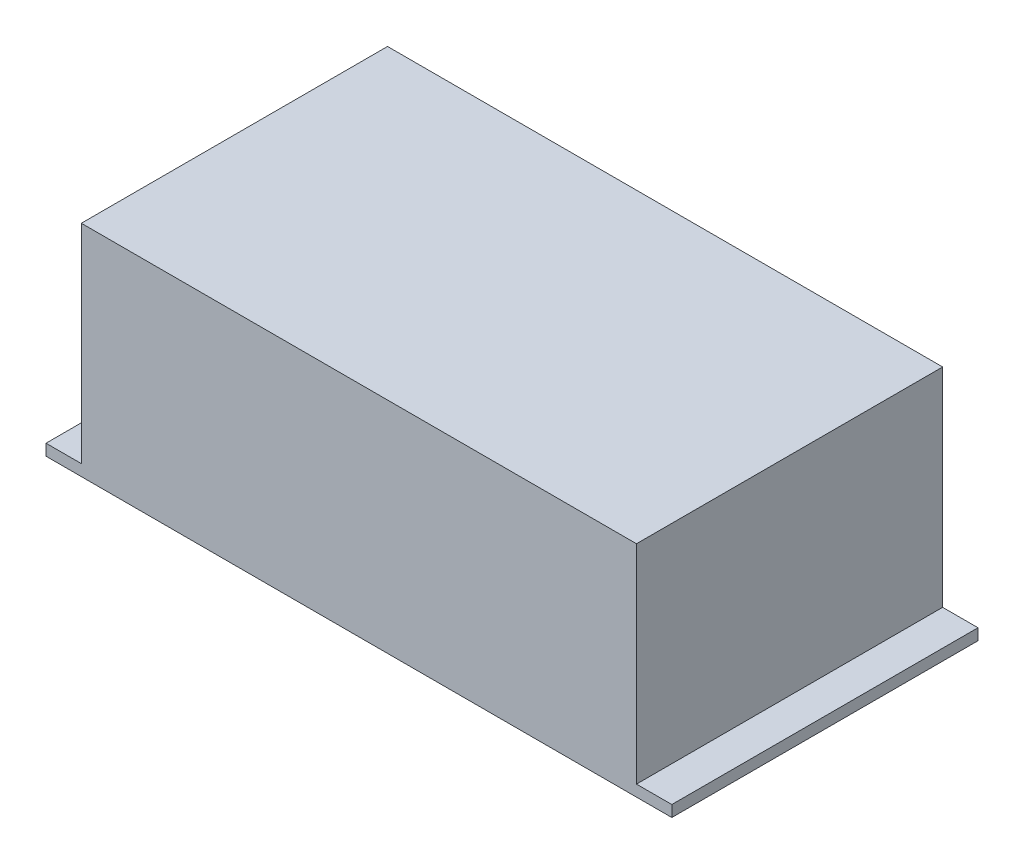
ISO-10303-21;
HEADER;
FILE_DESCRIPTION(('STEP AP214'),'2;1');
FILE_NAME('part.step','',(''),(''),'','','');
FILE_SCHEMA(('AUTOMOTIVE_DESIGN { 1 0 10303 214 1 1 1 1 }'));
ENDSEC;
DATA;
#1=APPLICATION_CONTEXT('core data for automotive mechanical design processes');
#2=APPLICATION_PROTOCOL_DEFINITION('international standard','automotive_design',2000,#1);
#3=PRODUCT_CONTEXT('',#1,'mechanical');
#4=PRODUCT('Part','Part','',(#3));
#5=PRODUCT_RELATED_PRODUCT_CATEGORY('part','',(#4));
#6=PRODUCT_DEFINITION_FORMATION('','',#4);
#7=PRODUCT_DEFINITION_CONTEXT('part definition',#1,'design');
#8=PRODUCT_DEFINITION('design','',#6,#7);
#9=PRODUCT_DEFINITION_SHAPE('','',#8);
#10=(LENGTH_UNIT() NAMED_UNIT(*) SI_UNIT(.MILLI.,.METRE.));
#11=(NAMED_UNIT(*) PLANE_ANGLE_UNIT() SI_UNIT($,.RADIAN.));
#12=(NAMED_UNIT(*) SI_UNIT($,.STERADIAN.) SOLID_ANGLE_UNIT());
#13=UNCERTAINTY_MEASURE_WITH_UNIT(LENGTH_MEASURE(1.E-05),#10,'distance_accuracy_value','');
#14=(GEOMETRIC_REPRESENTATION_CONTEXT(3) GLOBAL_UNCERTAINTY_ASSIGNED_CONTEXT((#13)) GLOBAL_UNIT_ASSIGNED_CONTEXT((#10,
#11,#12)) REPRESENTATION_CONTEXT('',''));
#15=CARTESIAN_POINT('',(0.,0.,0.));
#16=DIRECTION('',(0.,0.,1.));
#17=DIRECTION('',(1.,0.,0.));
#18=AXIS2_PLACEMENT_3D('',#15,#16,#17);
#19=CARTESIAN_POINT('',(0.,1.3,0.));
#20=DIRECTION('',(0.,1.,0.));
#21=DIRECTION('',(0.,0.,1.));
#22=AXIS2_PLACEMENT_3D('',#19,#20,#21);
#23=PLANE('',#22);
#24=DIRECTION('',(0.,0.,-1.));
#25=VECTOR('',#24,1.);
#26=CARTESIAN_POINT('',(68.075,1.3,35.3));
#27=LINE('',#26,#25);
#28=CARTESIAN_POINT('',(68.075,1.3,35.3));
#29=VERTEX_POINT('',#28);
#30=CARTESIAN_POINT('',(68.075,1.3,0.));
#31=VERTEX_POINT('',#30);
#32=EDGE_CURVE('E129',#29,#31,#27,.T.);
#33=ORIENTED_EDGE('',*,*,#32,.F.);
#34=DIRECTION('',(1.,0.,0.));
#35=VECTOR('',#34,1.);
#36=CARTESIAN_POINT('',(0.,1.3,35.3));
#37=LINE('',#36,#35);
#38=CARTESIAN_POINT('',(72.15,1.3,35.3));
#39=VERTEX_POINT('',#38);
#40=EDGE_CURVE('E145',#29,#39,#37,.T.);
#41=ORIENTED_EDGE('',*,*,#40,.T.);
#42=DIRECTION('',(0.,0.,-1.));
#43=VECTOR('',#42,1.);
#44=CARTESIAN_POINT('',(72.15,1.3,0.));
#45=LINE('',#44,#43);
#46=CARTESIAN_POINT('',(72.15,1.3,0.));
#47=VERTEX_POINT('',#46);
#48=EDGE_CURVE('E149',#39,#47,#45,.T.);
#49=ORIENTED_EDGE('',*,*,#48,.T.);
#50=DIRECTION('',(-1.,0.,0.));
#51=VECTOR('',#50,1.);
#52=CARTESIAN_POINT('',(0.,1.3,0.));
#53=LINE('',#52,#51);
#54=EDGE_CURVE('E65',#47,#31,#53,.T.);
#55=ORIENTED_EDGE('',*,*,#54,.T.);
#56=EDGE_LOOP('',(#33,#41,#49,#55));
#57=FACE_BOUND('',#56,.T.);
#58=ADVANCED_FACE('F40',(#57),#23,.T.);
#59=CARTESIAN_POINT('',(0.,1.3,0.));
#60=DIRECTION('',(1.,0.,0.));
#61=DIRECTION('',(0.,0.,-1.));
#62=AXIS2_PLACEMENT_3D('',#59,#60,#61);
#63=PLANE('',#62);
#64=DIRECTION('',(0.,0.,1.));
#65=VECTOR('',#64,1.);
#66=CARTESIAN_POINT('',(0.,0.,0.));
#67=LINE('',#66,#65);
#68=CARTESIAN_POINT('',(0.,0.,0.));
#69=VERTEX_POINT('',#68);
#70=CARTESIAN_POINT('',(0.,0.,35.3));
#71=VERTEX_POINT('',#70);
#72=EDGE_CURVE('E130',#69,#71,#67,.T.);
#73=ORIENTED_EDGE('',*,*,#72,.T.);
#74=DIRECTION('',(0.,-1.,0.));
#75=VECTOR('',#74,1.);
#76=CARTESIAN_POINT('',(0.,1.3,35.3));
#77=LINE('',#76,#75);
#78=CARTESIAN_POINT('',(0.,1.3,35.3));
#79=VERTEX_POINT('',#78);
#80=EDGE_CURVE('E11',#79,#71,#77,.T.);
#81=ORIENTED_EDGE('',*,*,#80,.F.);
#82=DIRECTION('',(0.,0.,1.));
#83=VECTOR('',#82,1.);
#84=CARTESIAN_POINT('',(0.,1.3,0.));
#85=LINE('',#84,#83);
#86=CARTESIAN_POINT('',(0.,1.3,0.));
#87=VERTEX_POINT('',#86);
#88=EDGE_CURVE('E141',#87,#79,#85,.T.);
#89=ORIENTED_EDGE('',*,*,#88,.F.);
#90=DIRECTION('',(0.,-1.,0.));
#91=VECTOR('',#90,1.);
#92=CARTESIAN_POINT('',(0.,1.3,0.));
#93=LINE('',#92,#91);
#94=EDGE_CURVE('E152',#87,#69,#93,.T.);
#95=ORIENTED_EDGE('',*,*,#94,.T.);
#96=EDGE_LOOP('',(#73,#81,#89,#95));
#97=FACE_BOUND('',#96,.T.);
#98=ADVANCED_FACE('F42',(#97),#63,.F.);
#99=CARTESIAN_POINT('',(0.,1.3,35.3));
#100=DIRECTION('',(0.,0.,-1.));
#101=DIRECTION('',(-1.,0.,0.));
#102=AXIS2_PLACEMENT_3D('',#99,#100,#101);
#103=PLANE('',#102);
#104=DIRECTION('',(1.,0.,0.));
#105=VECTOR('',#104,1.);
#106=CARTESIAN_POINT('',(0.,0.,35.3));
#107=LINE('',#106,#105);
#108=CARTESIAN_POINT('',(72.15,0.,35.3));
#109=VERTEX_POINT('',#108);
#110=EDGE_CURVE('E134',#71,#109,#107,.T.);
#111=ORIENTED_EDGE('',*,*,#110,.T.);
#112=DIRECTION('',(0.,-1.,0.));
#113=VECTOR('',#112,1.);
#114=CARTESIAN_POINT('',(72.15,1.3,35.3));
#115=LINE('',#114,#113);
#116=EDGE_CURVE('E48',#39,#109,#115,.T.);
#117=ORIENTED_EDGE('',*,*,#116,.F.);
#118=ORIENTED_EDGE('',*,*,#40,.F.);
#119=DIRECTION('',(0.,-1.,0.));
#120=VECTOR('',#119,1.);
#121=CARTESIAN_POINT('',(68.075,25.3,35.3));
#122=LINE('',#121,#120);
#123=CARTESIAN_POINT('',(68.075,25.3,35.3));
#124=VERTEX_POINT('',#123);
#125=EDGE_CURVE('E187',#124,#29,#122,.T.);
#126=ORIENTED_EDGE('',*,*,#125,.F.);
#127=DIRECTION('',(1.,0.,0.));
#128=VECTOR('',#127,1.);
#129=CARTESIAN_POINT('',(68.075,25.3,35.3));
#130=LINE('',#129,#128);
#131=CARTESIAN_POINT('',(4.075,25.3,35.3));
#132=VERTEX_POINT('',#131);
#133=EDGE_CURVE('E123',#132,#124,#130,.T.);
#134=ORIENTED_EDGE('',*,*,#133,.F.);
#135=DIRECTION('',(0.,-1.,0.));
#136=VECTOR('',#135,1.);
#137=CARTESIAN_POINT('',(4.075,25.3,35.3));
#138=LINE('',#137,#136);
#139=CARTESIAN_POINT('',(4.075,1.3,35.3));
#140=VERTEX_POINT('',#139);
#141=EDGE_CURVE('E137',#132,#140,#138,.T.);
#142=ORIENTED_EDGE('',*,*,#141,.T.);
#143=EDGE_CURVE('E147',#79,#140,#37,.T.);
#144=ORIENTED_EDGE('',*,*,#143,.F.);
#145=ORIENTED_EDGE('',*,*,#80,.T.);
#146=EDGE_LOOP('',(#111,#117,#118,#126,#134,#142,#144,#145));
#147=FACE_BOUND('',#146,.T.);
#148=ADVANCED_FACE('F193',(#147),#103,.F.);
#149=CARTESIAN_POINT('',(72.15,1.3,0.));
#150=DIRECTION('',(-1.,0.,0.));
#151=DIRECTION('',(0.,0.,1.));
#152=AXIS2_PLACEMENT_3D('',#149,#150,#151);
#153=PLANE('',#152);
#154=DIRECTION('',(0.,0.,-1.));
#155=VECTOR('',#154,1.);
#156=CARTESIAN_POINT('',(72.15,0.,0.));
#157=LINE('',#156,#155);
#158=CARTESIAN_POINT('',(72.15,0.,0.));
#159=VERTEX_POINT('',#158);
#160=EDGE_CURVE('E156',#109,#159,#157,.T.);
#161=ORIENTED_EDGE('',*,*,#160,.T.);
#162=DIRECTION('',(0.,-1.,0.));
#163=VECTOR('',#162,1.);
#164=CARTESIAN_POINT('',(72.15,1.3,0.));
#165=LINE('',#164,#163);
#166=EDGE_CURVE('E162',#47,#159,#165,.T.);
#167=ORIENTED_EDGE('',*,*,#166,.F.);
#168=ORIENTED_EDGE('',*,*,#48,.F.);
#169=ORIENTED_EDGE('',*,*,#116,.T.);
#170=EDGE_LOOP('',(#161,#167,#168,#169));
#171=FACE_BOUND('',#170,.T.);
#172=ADVANCED_FACE('F169',(#171),#153,.F.);
#173=CARTESIAN_POINT('',(0.,1.3,0.));
#174=DIRECTION('',(0.,0.,1.));
#175=DIRECTION('',(1.,0.,0.));
#176=AXIS2_PLACEMENT_3D('',#173,#174,#175);
#177=PLANE('',#176);
#178=DIRECTION('',(-1.,0.,0.));
#179=VECTOR('',#178,1.);
#180=CARTESIAN_POINT('',(0.,0.,0.));
#181=LINE('',#180,#179);
#182=EDGE_CURVE('E146',#159,#69,#181,.T.);
#183=ORIENTED_EDGE('',*,*,#182,.T.);
#184=ORIENTED_EDGE('',*,*,#94,.F.);
#185=CARTESIAN_POINT('',(4.075,1.3,0.));
#186=VERTEX_POINT('',#185);
#187=EDGE_CURVE('E151',#186,#87,#53,.T.);
#188=ORIENTED_EDGE('',*,*,#187,.F.);
#189=DIRECTION('',(0.,-1.,0.));
#190=VECTOR('',#189,1.);
#191=CARTESIAN_POINT('',(4.075,25.3,0.));
#192=LINE('',#191,#190);
#193=CARTESIAN_POINT('',(4.075,25.3,0.));
#194=VERTEX_POINT('',#193);
#195=EDGE_CURVE('E113',#194,#186,#192,.T.);
#196=ORIENTED_EDGE('',*,*,#195,.F.);
#197=DIRECTION('',(-1.,0.,0.));
#198=VECTOR('',#197,1.);
#199=CARTESIAN_POINT('',(68.075,25.3,0.));
#200=LINE('',#199,#198);
#201=CARTESIAN_POINT('',(68.075,25.3,0.));
#202=VERTEX_POINT('',#201);
#203=EDGE_CURVE('E106',#202,#194,#200,.T.);
#204=ORIENTED_EDGE('',*,*,#203,.F.);
#205=DIRECTION('',(0.,-1.,0.));
#206=VECTOR('',#205,1.);
#207=CARTESIAN_POINT('',(68.075,25.3,0.));
#208=LINE('',#207,#206);
#209=EDGE_CURVE('E110',#202,#31,#208,.T.);
#210=ORIENTED_EDGE('',*,*,#209,.T.);
#211=ORIENTED_EDGE('',*,*,#54,.F.);
#212=ORIENTED_EDGE('',*,*,#166,.T.);
#213=EDGE_LOOP('',(#183,#184,#188,#196,#204,#210,#211,#212));
#214=FACE_BOUND('',#213,.T.);
#215=ADVANCED_FACE('F108',(#214),#177,.F.);
#216=DIRECTION('',(0.,0.,1.));
#217=VECTOR('',#216,1.);
#218=CARTESIAN_POINT('',(4.075,1.3,35.3));
#219=LINE('',#218,#217);
#220=EDGE_CURVE('E57',#186,#140,#219,.T.);
#221=ORIENTED_EDGE('',*,*,#220,.F.);
#222=ORIENTED_EDGE('',*,*,#187,.T.);
#223=ORIENTED_EDGE('',*,*,#88,.T.);
#224=ORIENTED_EDGE('',*,*,#143,.T.);
#225=EDGE_LOOP('',(#221,#222,#223,#224));
#226=FACE_BOUND('',#225,.T.);
#227=ADVANCED_FACE('F181',(#226),#23,.T.);
#228=CARTESIAN_POINT('',(0.,0.,0.));
#229=DIRECTION('',(0.,1.,0.));
#230=DIRECTION('',(0.,0.,1.));
#231=AXIS2_PLACEMENT_3D('',#228,#229,#230);
#232=PLANE('',#231);
#233=ORIENTED_EDGE('',*,*,#72,.F.);
#234=ORIENTED_EDGE('',*,*,#182,.F.);
#235=ORIENTED_EDGE('',*,*,#160,.F.);
#236=ORIENTED_EDGE('',*,*,#110,.F.);
#237=EDGE_LOOP('',(#233,#234,#235,#236));
#238=FACE_BOUND('',#237,.T.);
#239=ADVANCED_FACE('F176',(#238),#232,.F.);
#240=CARTESIAN_POINT('',(68.075,25.3,35.3));
#241=DIRECTION('',(-1.,0.,0.));
#242=DIRECTION('',(0.,0.,1.));
#243=AXIS2_PLACEMENT_3D('',#240,#241,#242);
#244=PLANE('',#243);
#245=ORIENTED_EDGE('',*,*,#32,.T.);
#246=ORIENTED_EDGE('',*,*,#209,.F.);
#247=DIRECTION('',(0.,0.,-1.));
#248=VECTOR('',#247,1.);
#249=CARTESIAN_POINT('',(68.075,25.3,35.3));
#250=LINE('',#249,#248);
#251=EDGE_CURVE('E118',#124,#202,#250,.T.);
#252=ORIENTED_EDGE('',*,*,#251,.F.);
#253=ORIENTED_EDGE('',*,*,#125,.T.);
#254=EDGE_LOOP('',(#245,#246,#252,#253));
#255=FACE_BOUND('',#254,.T.);
#256=ADVANCED_FACE('F128',(#255),#244,.F.);
#257=CARTESIAN_POINT('',(4.075,25.3,35.3));
#258=DIRECTION('',(1.,0.,0.));
#259=DIRECTION('',(0.,0.,-1.));
#260=AXIS2_PLACEMENT_3D('',#257,#258,#259);
#261=PLANE('',#260);
#262=ORIENTED_EDGE('',*,*,#220,.T.);
#263=ORIENTED_EDGE('',*,*,#141,.F.);
#264=DIRECTION('',(0.,0.,1.));
#265=VECTOR('',#264,1.);
#266=CARTESIAN_POINT('',(4.075,25.3,35.3));
#267=LINE('',#266,#265);
#268=EDGE_CURVE('E117',#194,#132,#267,.T.);
#269=ORIENTED_EDGE('',*,*,#268,.F.);
#270=ORIENTED_EDGE('',*,*,#195,.T.);
#271=EDGE_LOOP('',(#262,#263,#269,#270));
#272=FACE_BOUND('',#271,.T.);
#273=ADVANCED_FACE('F195',(#272),#261,.F.);
#274=CARTESIAN_POINT('',(0.,25.3,0.));
#275=DIRECTION('',(0.,1.,0.));
#276=DIRECTION('',(0.,0.,1.));
#277=AXIS2_PLACEMENT_3D('',#274,#275,#276);
#278=PLANE('',#277);
#279=ORIENTED_EDGE('',*,*,#251,.T.);
#280=ORIENTED_EDGE('',*,*,#203,.T.);
#281=ORIENTED_EDGE('',*,*,#268,.T.);
#282=ORIENTED_EDGE('',*,*,#133,.T.);
#283=EDGE_LOOP('',(#279,#280,#281,#282));
#284=FACE_BOUND('',#283,.T.);
#285=ADVANCED_FACE('F121',(#284),#278,.T.);
#286=CLOSED_SHELL('',(#58,#98,#148,#172,#215,#227,#239,#256,#273,#285));
#287=MANIFOLD_SOLID_BREP('B2',#286);
#288=ADVANCED_BREP_SHAPE_REPRESENTATION('',(#18,#287),#14);
#289=SHAPE_DEFINITION_REPRESENTATION(#9,#288);
ENDSEC;
END-ISO-10303-21;
